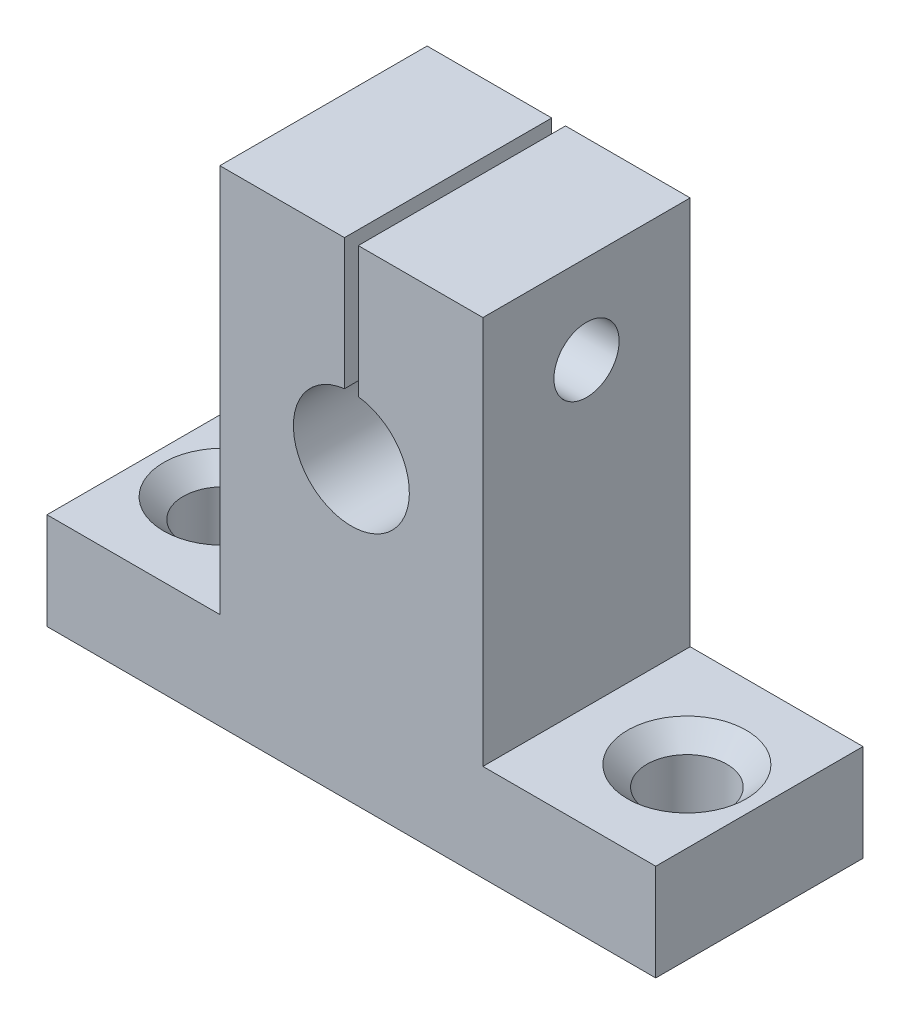
ISO-10303-21;
HEADER;
FILE_DESCRIPTION(('STEP AP214'),'2;1');
FILE_NAME('part.step','',(''),(''),'','','');
FILE_SCHEMA(('AUTOMOTIVE_DESIGN { 1 0 10303 214 1 1 1 1 }'));
ENDSEC;
DATA;
#1=APPLICATION_CONTEXT('core data for automotive mechanical design processes');
#2=APPLICATION_PROTOCOL_DEFINITION('international standard','automotive_design',2000,#1);
#3=PRODUCT_CONTEXT('',#1,'mechanical');
#4=PRODUCT('Part','Part','',(#3));
#5=PRODUCT_RELATED_PRODUCT_CATEGORY('part','',(#4));
#6=PRODUCT_DEFINITION_FORMATION('','',#4);
#7=PRODUCT_DEFINITION_CONTEXT('part definition',#1,'design');
#8=PRODUCT_DEFINITION('design','',#6,#7);
#9=PRODUCT_DEFINITION_SHAPE('','',#8);
#10=(LENGTH_UNIT() NAMED_UNIT(*) SI_UNIT(.MILLI.,.METRE.));
#11=(NAMED_UNIT(*) PLANE_ANGLE_UNIT() SI_UNIT($,.RADIAN.));
#12=(NAMED_UNIT(*) SI_UNIT($,.STERADIAN.) SOLID_ANGLE_UNIT());
#13=UNCERTAINTY_MEASURE_WITH_UNIT(LENGTH_MEASURE(1.E-05),#10,'distance_accuracy_value','');
#14=(GEOMETRIC_REPRESENTATION_CONTEXT(3) GLOBAL_UNCERTAINTY_ASSIGNED_CONTEXT((#13)) GLOBAL_UNIT_ASSIGNED_CONTEXT((#10,
#11,#12)) REPRESENTATION_CONTEXT('',''));
#15=CARTESIAN_POINT('',(0.,0.,0.));
#16=DIRECTION('',(0.,0.,1.));
#17=DIRECTION('',(1.,0.,0.));
#18=AXIS2_PLACEMENT_3D('',#15,#16,#17);
#19=CARTESIAN_POINT('',(11.925,33.5,7.15));
#20=DIRECTION('',(1.,0.,0.));
#21=DIRECTION('',(0.,0.,-1.));
#22=AXIS2_PLACEMENT_3D('',#19,#20,#21);
#23=PLANE('',#22);
#24=DIRECTION('',(0.,-1.,0.));
#25=VECTOR('',#24,1.);
#26=CARTESIAN_POINT('',(11.925,33.5,-7.15));
#27=LINE('',#26,#25);
#28=CARTESIAN_POINT('',(11.925,33.5,-7.15));
#29=VERTEX_POINT('',#28);
#30=CARTESIAN_POINT('',(11.925,6.68,-7.15));
#31=VERTEX_POINT('',#30);
#32=EDGE_CURVE('E166',#29,#31,#27,.T.);
#33=ORIENTED_EDGE('',*,*,#32,.T.);
#34=DIRECTION('',(0.,0.,-1.));
#35=VECTOR('',#34,1.);
#36=CARTESIAN_POINT('',(11.925,6.68,7.15));
#37=LINE('',#36,#35);
#38=CARTESIAN_POINT('',(11.925,6.68,7.15));
#39=VERTEX_POINT('',#38);
#40=EDGE_CURVE('E11',#39,#31,#37,.T.);
#41=ORIENTED_EDGE('',*,*,#40,.F.);
#42=DIRECTION('',(0.,-1.,0.));
#43=VECTOR('',#42,1.);
#44=CARTESIAN_POINT('',(11.925,33.5,7.15));
#45=LINE('',#44,#43);
#46=CARTESIAN_POINT('',(11.925,33.5,7.15));
#47=VERTEX_POINT('',#46);
#48=EDGE_CURVE('E189',#47,#39,#45,.T.);
#49=ORIENTED_EDGE('',*,*,#48,.F.);
#50=DIRECTION('',(0.,0.,-1.));
#51=VECTOR('',#50,1.);
#52=CARTESIAN_POINT('',(11.925,33.5,7.15));
#53=LINE('',#52,#51);
#54=EDGE_CURVE('E162',#47,#29,#53,.T.);
#55=ORIENTED_EDGE('',*,*,#54,.T.);
#56=EDGE_LOOP('',(#33,#41,#49,#55));
#57=FACE_BOUND('',#56,.T.);
#58=CARTESIAN_POINT('',(11.925,27.4,0.));
#59=DIRECTION('',(-1.,0.,0.));
#60=DIRECTION('',(0.,0.,1.));
#61=AXIS2_PLACEMENT_3D('',#58,#59,#60);
#62=CIRCLE('',#61,4.);
#63=CARTESIAN_POINT('',(11.925,27.4,4.));
#64=VERTEX_POINT('',#63);
#65=EDGE_CURVE('E475',#64,#64,#62,.T.);
#66=ORIENTED_EDGE('',*,*,#65,.F.);
#67=EDGE_LOOP('',(#66));
#68=FACE_BOUND('',#67,.T.);
#69=ADVANCED_FACE('F45',(#57,#68),#23,.F.);
#70=CARTESIAN_POINT('',(11.925,6.68,7.15));
#71=DIRECTION('',(0.,-1.,0.));
#72=DIRECTION('',(1.,0.,0.));
#73=AXIS2_PLACEMENT_3D('',#70,#71,#72);
#74=PLANE('',#73);
#75=CARTESIAN_POINT('',(5.,6.68,0.));
#76=DIRECTION('',(0.,1.,0.));
#77=DIRECTION('',(0.,0.,1.));
#78=AXIS2_PLACEMENT_3D('',#75,#76,#77);
#79=CIRCLE('',#78,4.1);
#80=CARTESIAN_POINT('',(5.,6.68,4.1));
#81=VERTEX_POINT('',#80);
#82=EDGE_CURVE('E505',#81,#81,#79,.T.);
#83=ORIENTED_EDGE('',*,*,#82,.F.);
#84=EDGE_LOOP('',(#83));
#85=FACE_BOUND('',#84,.T.);
#86=DIRECTION('',(-1.,0.,0.));
#87=VECTOR('',#86,1.);
#88=CARTESIAN_POINT('',(11.925,6.68,-7.15));
#89=LINE('',#88,#87);
#90=CARTESIAN_POINT('',(0.,6.68,-7.15));
#91=VERTEX_POINT('',#90);
#92=EDGE_CURVE('E169',#31,#91,#89,.T.);
#93=ORIENTED_EDGE('',*,*,#92,.T.);
#94=DIRECTION('',(0.,0.,-1.));
#95=VECTOR('',#94,1.);
#96=CARTESIAN_POINT('',(0.,6.68,7.15));
#97=LINE('',#96,#95);
#98=CARTESIAN_POINT('',(0.,6.68,7.15));
#99=VERTEX_POINT('',#98);
#100=EDGE_CURVE('E54',#99,#91,#97,.T.);
#101=ORIENTED_EDGE('',*,*,#100,.F.);
#102=DIRECTION('',(-1.,0.,0.));
#103=VECTOR('',#102,1.);
#104=CARTESIAN_POINT('',(11.925,6.68,7.15));
#105=LINE('',#104,#103);
#106=EDGE_CURVE('E117',#39,#99,#105,.T.);
#107=ORIENTED_EDGE('',*,*,#106,.F.);
#108=ORIENTED_EDGE('',*,*,#40,.T.);
#109=EDGE_LOOP('',(#93,#101,#107,#108));
#110=FACE_BOUND('',#109,.T.);
#111=ADVANCED_FACE('F271',(#85,#110),#74,.F.);
#112=CARTESIAN_POINT('',(0.,6.68,7.15));
#113=DIRECTION('',(1.,0.,0.));
#114=DIRECTION('',(0.,0.,-1.));
#115=AXIS2_PLACEMENT_3D('',#112,#113,#114);
#116=PLANE('',#115);
#117=DIRECTION('',(0.,-1.,0.));
#118=VECTOR('',#117,1.);
#119=CARTESIAN_POINT('',(0.,6.68,-7.15));
#120=LINE('',#119,#118);
#121=CARTESIAN_POINT('',(0.,0.,-7.15));
#122=VERTEX_POINT('',#121);
#123=EDGE_CURVE('E172',#91,#122,#120,.T.);
#124=ORIENTED_EDGE('',*,*,#123,.T.);
#125=DIRECTION('',(0.,0.,-1.));
#126=VECTOR('',#125,1.);
#127=CARTESIAN_POINT('',(0.,0.,7.15));
#128=LINE('',#127,#126);
#129=CARTESIAN_POINT('',(0.,0.,7.15));
#130=VERTEX_POINT('',#129);
#131=EDGE_CURVE('E208',#130,#122,#128,.T.);
#132=ORIENTED_EDGE('',*,*,#131,.F.);
#133=DIRECTION('',(0.,-1.,0.));
#134=VECTOR('',#133,1.);
#135=CARTESIAN_POINT('',(0.,6.68,7.15));
#136=LINE('',#135,#134);
#137=EDGE_CURVE('E217',#99,#130,#136,.T.);
#138=ORIENTED_EDGE('',*,*,#137,.F.);
#139=ORIENTED_EDGE('',*,*,#100,.T.);
#140=EDGE_LOOP('',(#124,#132,#138,#139));
#141=FACE_BOUND('',#140,.T.);
#142=ADVANCED_FACE('F215',(#141),#116,.F.);
#143=CARTESIAN_POINT('',(0.,0.,7.15));
#144=DIRECTION('',(0.,1.,0.));
#145=DIRECTION('',(0.,0.,1.));
#146=AXIS2_PLACEMENT_3D('',#143,#144,#145);
#147=PLANE('',#146);
#148=CARTESIAN_POINT('',(5.,0.,0.));
#149=DIRECTION('',(0.,1.,0.));
#150=DIRECTION('',(0.,0.,1.));
#151=AXIS2_PLACEMENT_3D('',#148,#149,#150);
#152=CIRCLE('',#151,2.75);
#153=CARTESIAN_POINT('',(5.,0.,2.75));
#154=VERTEX_POINT('',#153);
#155=EDGE_CURVE('E499',#154,#154,#152,.T.);
#156=ORIENTED_EDGE('',*,*,#155,.T.);
#157=EDGE_LOOP('',(#156));
#158=FACE_BOUND('',#157,.T.);
#159=CARTESIAN_POINT('',(37.,0.,0.));
#160=DIRECTION('',(0.,1.,0.));
#161=DIRECTION('',(0.,0.,1.));
#162=AXIS2_PLACEMENT_3D('',#159,#160,#161);
#163=CIRCLE('',#162,2.75);
#164=CARTESIAN_POINT('',(37.,0.,2.75));
#165=VERTEX_POINT('',#164);
#166=EDGE_CURVE('E490',#165,#165,#163,.T.);
#167=ORIENTED_EDGE('',*,*,#166,.T.);
#168=EDGE_LOOP('',(#167));
#169=FACE_BOUND('',#168,.T.);
#170=DIRECTION('',(1.,0.,0.));
#171=VECTOR('',#170,1.);
#172=CARTESIAN_POINT('',(0.,0.,-7.15));
#173=LINE('',#172,#171);
#174=CARTESIAN_POINT('',(42.,0.,-7.15));
#175=VERTEX_POINT('',#174);
#176=EDGE_CURVE('E174',#122,#175,#173,.T.);
#177=ORIENTED_EDGE('',*,*,#176,.T.);
#178=DIRECTION('',(0.,0.,-1.));
#179=VECTOR('',#178,1.);
#180=CARTESIAN_POINT('',(42.,0.,7.15));
#181=LINE('',#180,#179);
#182=CARTESIAN_POINT('',(42.,0.,7.15));
#183=VERTEX_POINT('',#182);
#184=EDGE_CURVE('E205',#183,#175,#181,.T.);
#185=ORIENTED_EDGE('',*,*,#184,.F.);
#186=DIRECTION('',(1.,0.,0.));
#187=VECTOR('',#186,1.);
#188=CARTESIAN_POINT('',(0.,0.,7.15));
#189=LINE('',#188,#187);
#190=EDGE_CURVE('E235',#130,#183,#189,.T.);
#191=ORIENTED_EDGE('',*,*,#190,.F.);
#192=ORIENTED_EDGE('',*,*,#131,.T.);
#193=EDGE_LOOP('',(#177,#185,#191,#192));
#194=FACE_BOUND('',#193,.T.);
#195=ADVANCED_FACE('F226',(#158,#169,#194),#147,.F.);
#196=CARTESIAN_POINT('',(42.,0.,7.15));
#197=DIRECTION('',(-1.,0.,0.));
#198=DIRECTION('',(0.,0.,1.));
#199=AXIS2_PLACEMENT_3D('',#196,#197,#198);
#200=PLANE('',#199);
#201=DIRECTION('',(0.,1.,0.));
#202=VECTOR('',#201,1.);
#203=CARTESIAN_POINT('',(42.,0.,-7.15));
#204=LINE('',#203,#202);
#205=CARTESIAN_POINT('',(42.,6.68,-7.15));
#206=VERTEX_POINT('',#205);
#207=EDGE_CURVE('E176',#175,#206,#204,.T.);
#208=ORIENTED_EDGE('',*,*,#207,.T.);
#209=DIRECTION('',(0.,0.,-1.));
#210=VECTOR('',#209,1.);
#211=CARTESIAN_POINT('',(42.,6.68,7.15));
#212=LINE('',#211,#210);
#213=CARTESIAN_POINT('',(42.,6.68,7.15));
#214=VERTEX_POINT('',#213);
#215=EDGE_CURVE('E202',#214,#206,#212,.T.);
#216=ORIENTED_EDGE('',*,*,#215,.F.);
#217=DIRECTION('',(0.,1.,0.));
#218=VECTOR('',#217,1.);
#219=CARTESIAN_POINT('',(42.,0.,7.15));
#220=LINE('',#219,#218);
#221=EDGE_CURVE('E232',#183,#214,#220,.T.);
#222=ORIENTED_EDGE('',*,*,#221,.F.);
#223=ORIENTED_EDGE('',*,*,#184,.T.);
#224=EDGE_LOOP('',(#208,#216,#222,#223));
#225=FACE_BOUND('',#224,.T.);
#226=ADVANCED_FACE('F230',(#225),#200,.F.);
#227=CARTESIAN_POINT('',(42.,6.68,7.15));
#228=DIRECTION('',(0.,-1.,0.));
#229=DIRECTION('',(0.,0.,-1.));
#230=AXIS2_PLACEMENT_3D('',#227,#228,#229);
#231=PLANE('',#230);
#232=CARTESIAN_POINT('',(37.,6.68,0.));
#233=DIRECTION('',(0.,1.,0.));
#234=DIRECTION('',(0.,0.,1.));
#235=AXIS2_PLACEMENT_3D('',#232,#233,#234);
#236=CIRCLE('',#235,4.1);
#237=CARTESIAN_POINT('',(37.,6.68,4.1));
#238=VERTEX_POINT('',#237);
#239=EDGE_CURVE('E496',#238,#238,#236,.T.);
#240=ORIENTED_EDGE('',*,*,#239,.F.);
#241=EDGE_LOOP('',(#240));
#242=FACE_BOUND('',#241,.T.);
#243=DIRECTION('',(-1.,0.,0.));
#244=VECTOR('',#243,1.);
#245=CARTESIAN_POINT('',(42.,6.68,-7.15));
#246=LINE('',#245,#244);
#247=CARTESIAN_POINT('',(30.075,6.68,-7.15));
#248=VERTEX_POINT('',#247);
#249=EDGE_CURVE('E178',#206,#248,#246,.T.);
#250=ORIENTED_EDGE('',*,*,#249,.T.);
#251=DIRECTION('',(0.,0.,-1.));
#252=VECTOR('',#251,1.);
#253=CARTESIAN_POINT('',(30.075,6.68,7.15));
#254=LINE('',#253,#252);
#255=CARTESIAN_POINT('',(30.075,6.68,7.15));
#256=VERTEX_POINT('',#255);
#257=EDGE_CURVE('E199',#256,#248,#254,.T.);
#258=ORIENTED_EDGE('',*,*,#257,.F.);
#259=DIRECTION('',(-1.,0.,0.));
#260=VECTOR('',#259,1.);
#261=CARTESIAN_POINT('',(42.,6.68,7.15));
#262=LINE('',#261,#260);
#263=EDGE_CURVE('E234',#214,#256,#262,.T.);
#264=ORIENTED_EDGE('',*,*,#263,.F.);
#265=ORIENTED_EDGE('',*,*,#215,.T.);
#266=EDGE_LOOP('',(#250,#258,#264,#265));
#267=FACE_BOUND('',#266,.T.);
#268=ADVANCED_FACE('F290',(#242,#267),#231,.F.);
#269=CARTESIAN_POINT('',(30.075,6.68,7.15));
#270=DIRECTION('',(-1.,0.,0.));
#271=DIRECTION('',(0.,0.,1.));
#272=AXIS2_PLACEMENT_3D('',#269,#270,#271);
#273=PLANE('',#272);
#274=CARTESIAN_POINT('',(30.075,27.4,0.));
#275=DIRECTION('',(-1.,0.,0.));
#276=DIRECTION('',(0.,0.,1.));
#277=AXIS2_PLACEMENT_3D('',#274,#275,#276);
#278=CIRCLE('',#277,2.25);
#279=CARTESIAN_POINT('',(30.075,27.4,2.25));
#280=VERTEX_POINT('',#279);
#281=EDGE_CURVE('E170',#280,#280,#278,.T.);
#282=ORIENTED_EDGE('',*,*,#281,.T.);
#283=EDGE_LOOP('',(#282));
#284=FACE_BOUND('',#283,.T.);
#285=DIRECTION('',(0.,1.,0.));
#286=VECTOR('',#285,1.);
#287=CARTESIAN_POINT('',(30.075,6.68,-7.15));
#288=LINE('',#287,#286);
#289=CARTESIAN_POINT('',(30.075,33.5,-7.15));
#290=VERTEX_POINT('',#289);
#291=EDGE_CURVE('E180',#248,#290,#288,.T.);
#292=ORIENTED_EDGE('',*,*,#291,.T.);
#293=DIRECTION('',(0.,0.,-1.));
#294=VECTOR('',#293,1.);
#295=CARTESIAN_POINT('',(30.075,33.5,7.15));
#296=LINE('',#295,#294);
#297=CARTESIAN_POINT('',(30.075,33.5,7.15));
#298=VERTEX_POINT('',#297);
#299=EDGE_CURVE('E196',#298,#290,#296,.T.);
#300=ORIENTED_EDGE('',*,*,#299,.F.);
#301=DIRECTION('',(0.,1.,0.));
#302=VECTOR('',#301,1.);
#303=CARTESIAN_POINT('',(30.075,6.68,7.15));
#304=LINE('',#303,#302);
#305=EDGE_CURVE('E237',#256,#298,#304,.T.);
#306=ORIENTED_EDGE('',*,*,#305,.F.);
#307=ORIENTED_EDGE('',*,*,#257,.T.);
#308=EDGE_LOOP('',(#292,#300,#306,#307));
#309=FACE_BOUND('',#308,.T.);
#310=ADVANCED_FACE('F293',(#284,#309),#273,.F.);
#311=CARTESIAN_POINT('',(30.075,33.5,7.15));
#312=DIRECTION('',(0.,-1.,0.));
#313=DIRECTION('',(1.,0.,0.));
#314=AXIS2_PLACEMENT_3D('',#311,#312,#313);
#315=PLANE('',#314);
#316=DIRECTION('',(-1.,0.,0.));
#317=VECTOR('',#316,1.);
#318=CARTESIAN_POINT('',(30.075,33.5,-7.15));
#319=LINE('',#318,#317);
#320=CARTESIAN_POINT('',(21.475,33.5,-7.15));
#321=VERTEX_POINT('',#320);
#322=EDGE_CURVE('E182',#290,#321,#319,.T.);
#323=ORIENTED_EDGE('',*,*,#322,.T.);
#324=DIRECTION('',(0.,0.,-1.));
#325=VECTOR('',#324,1.);
#326=CARTESIAN_POINT('',(21.475,33.5,7.15));
#327=LINE('',#326,#325);
#328=CARTESIAN_POINT('',(21.475,33.5,7.15));
#329=VERTEX_POINT('',#328);
#330=EDGE_CURVE('E193',#329,#321,#327,.T.);
#331=ORIENTED_EDGE('',*,*,#330,.F.);
#332=DIRECTION('',(-1.,0.,0.));
#333=VECTOR('',#332,1.);
#334=CARTESIAN_POINT('',(30.075,33.5,7.15));
#335=LINE('',#334,#333);
#336=EDGE_CURVE('E243',#298,#329,#335,.T.);
#337=ORIENTED_EDGE('',*,*,#336,.F.);
#338=ORIENTED_EDGE('',*,*,#299,.T.);
#339=EDGE_LOOP('',(#323,#331,#337,#338));
#340=FACE_BOUND('',#339,.T.);
#341=ADVANCED_FACE('F249',(#340),#315,.F.);
#342=CARTESIAN_POINT('',(21.475,24.471696740689,7.15));
#343=DIRECTION('',(1.,0.,0.));
#344=DIRECTION('',(0.,1.,0.));
#345=AXIS2_PLACEMENT_3D('',#342,#343,#344);
#346=PLANE('',#345);
#347=CARTESIAN_POINT('',(21.475,27.4,0.));
#348=DIRECTION('',(1.,0.,0.));
#349=DIRECTION('',(0.,1.,0.));
#350=AXIS2_PLACEMENT_3D('',#347,#348,#349);
#351=CIRCLE('',#350,2.25);
#352=CARTESIAN_POINT('',(21.475,29.65,0.));
#353=VERTEX_POINT('',#352);
#354=EDGE_CURVE('E469',#353,#353,#351,.T.);
#355=ORIENTED_EDGE('',*,*,#354,.T.);
#356=EDGE_LOOP('',(#355));
#357=FACE_BOUND('',#356,.T.);
#358=DIRECTION('',(0.,-1.,0.));
#359=VECTOR('',#358,1.);
#360=CARTESIAN_POINT('',(21.475,24.471696740689,-7.15));
#361=LINE('',#360,#359);
#362=CARTESIAN_POINT('',(21.475,24.471696740689,-7.15));
#363=VERTEX_POINT('',#362);
#364=EDGE_CURVE('E184',#321,#363,#361,.T.);
#365=ORIENTED_EDGE('',*,*,#364,.T.);
#366=DIRECTION('',(0.,0.,-1.));
#367=VECTOR('',#366,1.);
#368=CARTESIAN_POINT('',(21.475,24.471696740689,7.15));
#369=LINE('',#368,#367);
#370=CARTESIAN_POINT('',(21.475,24.471696740689,7.15));
#371=VERTEX_POINT('',#370);
#372=EDGE_CURVE('E157',#371,#363,#369,.T.);
#373=ORIENTED_EDGE('',*,*,#372,.F.);
#374=DIRECTION('',(0.,-1.,0.));
#375=VECTOR('',#374,1.);
#376=CARTESIAN_POINT('',(21.475,24.471696740689,7.15));
#377=LINE('',#376,#375);
#378=EDGE_CURVE('E148',#329,#371,#377,.T.);
#379=ORIENTED_EDGE('',*,*,#378,.F.);
#380=ORIENTED_EDGE('',*,*,#330,.T.);
#381=EDGE_LOOP('',(#365,#373,#379,#380));
#382=FACE_BOUND('',#381,.T.);
#383=ADVANCED_FACE('F253',(#357,#382),#346,.F.);
#384=CARTESIAN_POINT('',(21.,20.5,7.15));
#385=DIRECTION('',(0.,0.,-1.));
#386=DIRECTION('',(-1.,0.,0.));
#387=AXIS2_PLACEMENT_3D('',#384,#385,#386);
#388=CYLINDRICAL_SURFACE('',#387,4.);
#389=CARTESIAN_POINT('',(21.,20.5,-7.15));
#390=DIRECTION('',(0.,0.,-1.));
#391=DIRECTION('',(1.,0.,0.));
#392=AXIS2_PLACEMENT_3D('',#389,#390,#391);
#393=CIRCLE('',#392,4.);
#394=CARTESIAN_POINT('',(20.525,24.471696740689,-7.15));
#395=VERTEX_POINT('',#394);
#396=EDGE_CURVE('E156',#363,#395,#393,.T.);
#397=ORIENTED_EDGE('',*,*,#396,.T.);
#398=DIRECTION('',(0.,0.,-1.));
#399=VECTOR('',#398,1.);
#400=CARTESIAN_POINT('',(20.525,24.471696740689,7.15));
#401=LINE('',#400,#399);
#402=CARTESIAN_POINT('',(20.525,24.471696740689,7.15));
#403=VERTEX_POINT('',#402);
#404=EDGE_CURVE('E153',#403,#395,#401,.T.);
#405=ORIENTED_EDGE('',*,*,#404,.F.);
#406=CARTESIAN_POINT('',(21.,20.5,7.15));
#407=DIRECTION('',(0.,0.,-1.));
#408=DIRECTION('',(1.,0.,0.));
#409=AXIS2_PLACEMENT_3D('',#406,#407,#408);
#410=CIRCLE('',#409,4.);
#411=EDGE_CURVE('E142',#371,#403,#410,.T.);
#412=ORIENTED_EDGE('',*,*,#411,.F.);
#413=ORIENTED_EDGE('',*,*,#372,.T.);
#414=EDGE_LOOP('',(#397,#405,#412,#413));
#415=FACE_BOUND('',#414,.T.);
#416=ADVANCED_FACE('F154',(#415),#388,.F.);
#417=CARTESIAN_POINT('',(20.525,33.5,7.15));
#418=DIRECTION('',(-1.,0.,0.));
#419=DIRECTION('',(0.,0.,1.));
#420=AXIS2_PLACEMENT_3D('',#417,#418,#419);
#421=PLANE('',#420);
#422=CARTESIAN_POINT('',(20.525,27.4,0.));
#423=DIRECTION('',(-1.,0.,0.));
#424=DIRECTION('',(0.,0.,1.));
#425=AXIS2_PLACEMENT_3D('',#422,#423,#424);
#426=CIRCLE('',#425,2.25);
#427=CARTESIAN_POINT('',(20.525,27.4,2.25));
#428=VERTEX_POINT('',#427);
#429=EDGE_CURVE('E48',#428,#428,#426,.T.);
#430=ORIENTED_EDGE('',*,*,#429,.T.);
#431=EDGE_LOOP('',(#430));
#432=FACE_BOUND('',#431,.T.);
#433=DIRECTION('',(0.,1.,0.));
#434=VECTOR('',#433,1.);
#435=CARTESIAN_POINT('',(20.525,33.5,-7.15));
#436=LINE('',#435,#434);
#437=CARTESIAN_POINT('',(20.525,33.5,-7.15));
#438=VERTEX_POINT('',#437);
#439=EDGE_CURVE('E103',#395,#438,#436,.T.);
#440=ORIENTED_EDGE('',*,*,#439,.T.);
#441=DIRECTION('',(0.,0.,-1.));
#442=VECTOR('',#441,1.);
#443=CARTESIAN_POINT('',(20.525,33.5,7.15));
#444=LINE('',#443,#442);
#445=CARTESIAN_POINT('',(20.525,33.5,7.15));
#446=VERTEX_POINT('',#445);
#447=EDGE_CURVE('E158',#446,#438,#444,.T.);
#448=ORIENTED_EDGE('',*,*,#447,.F.);
#449=DIRECTION('',(0.,1.,0.));
#450=VECTOR('',#449,1.);
#451=CARTESIAN_POINT('',(20.525,33.5,7.15));
#452=LINE('',#451,#450);
#453=EDGE_CURVE('E146',#403,#446,#452,.T.);
#454=ORIENTED_EDGE('',*,*,#453,.F.);
#455=ORIENTED_EDGE('',*,*,#404,.T.);
#456=EDGE_LOOP('',(#440,#448,#454,#455));
#457=FACE_BOUND('',#456,.T.);
#458=ADVANCED_FACE('F160',(#432,#457),#421,.F.);
#459=CARTESIAN_POINT('',(20.525,33.5,7.15));
#460=DIRECTION('',(0.,-1.,0.));
#461=DIRECTION('',(1.,0.,0.));
#462=AXIS2_PLACEMENT_3D('',#459,#460,#461);
#463=PLANE('',#462);
#464=DIRECTION('',(-1.,0.,0.));
#465=VECTOR('',#464,1.);
#466=CARTESIAN_POINT('',(20.525,33.5,-7.15));
#467=LINE('',#466,#465);
#468=EDGE_CURVE('E109',#438,#29,#467,.T.);
#469=ORIENTED_EDGE('',*,*,#468,.T.);
#470=ORIENTED_EDGE('',*,*,#54,.F.);
#471=DIRECTION('',(-1.,0.,0.));
#472=VECTOR('',#471,1.);
#473=CARTESIAN_POINT('',(20.525,33.5,7.15));
#474=LINE('',#473,#472);
#475=EDGE_CURVE('E62',#446,#47,#474,.T.);
#476=ORIENTED_EDGE('',*,*,#475,.F.);
#477=ORIENTED_EDGE('',*,*,#447,.T.);
#478=EDGE_LOOP('',(#469,#470,#476,#477));
#479=FACE_BOUND('',#478,.T.);
#480=ADVANCED_FACE('F258',(#479),#463,.F.);
#481=CARTESIAN_POINT('',(21.,20.5,7.15));
#482=DIRECTION('',(0.,0.,1.));
#483=DIRECTION('',(1.,0.,0.));
#484=AXIS2_PLACEMENT_3D('',#481,#482,#483);
#485=PLANE('',#484);
#486=ORIENTED_EDGE('',*,*,#48,.T.);
#487=ORIENTED_EDGE('',*,*,#106,.T.);
#488=ORIENTED_EDGE('',*,*,#137,.T.);
#489=ORIENTED_EDGE('',*,*,#190,.T.);
#490=ORIENTED_EDGE('',*,*,#221,.T.);
#491=ORIENTED_EDGE('',*,*,#263,.T.);
#492=ORIENTED_EDGE('',*,*,#305,.T.);
#493=ORIENTED_EDGE('',*,*,#336,.T.);
#494=ORIENTED_EDGE('',*,*,#378,.T.);
#495=ORIENTED_EDGE('',*,*,#411,.T.);
#496=ORIENTED_EDGE('',*,*,#453,.T.);
#497=ORIENTED_EDGE('',*,*,#475,.T.);
#498=EDGE_LOOP('',(#486,#487,#488,#489,#490,#491,#492,#493,#494,#495,#496,#497));
#499=FACE_BOUND('',#498,.T.);
#500=ADVANCED_FACE('F144',(#499),#485,.T.);
#501=CARTESIAN_POINT('',(21.,20.5,-7.15));
#502=DIRECTION('',(0.,0.,1.));
#503=DIRECTION('',(1.,0.,0.));
#504=AXIS2_PLACEMENT_3D('',#501,#502,#503);
#505=PLANE('',#504);
#506=ORIENTED_EDGE('',*,*,#32,.F.);
#507=ORIENTED_EDGE('',*,*,#468,.F.);
#508=ORIENTED_EDGE('',*,*,#439,.F.);
#509=ORIENTED_EDGE('',*,*,#396,.F.);
#510=ORIENTED_EDGE('',*,*,#364,.F.);
#511=ORIENTED_EDGE('',*,*,#322,.F.);
#512=ORIENTED_EDGE('',*,*,#291,.F.);
#513=ORIENTED_EDGE('',*,*,#249,.F.);
#514=ORIENTED_EDGE('',*,*,#207,.F.);
#515=ORIENTED_EDGE('',*,*,#176,.F.);
#516=ORIENTED_EDGE('',*,*,#123,.F.);
#517=ORIENTED_EDGE('',*,*,#92,.F.);
#518=EDGE_LOOP('',(#506,#507,#508,#509,#510,#511,#512,#513,#514,#515,#516,#517));
#519=FACE_BOUND('',#518,.T.);
#520=ADVANCED_FACE('F221',(#519),#505,.F.);
#521=CARTESIAN_POINT('',(11.925,27.4,0.));
#522=DIRECTION('',(-1.,0.,0.));
#523=DIRECTION('',(0.,0.,1.));
#524=AXIS2_PLACEMENT_3D('',#521,#522,#523);
#525=CYLINDRICAL_SURFACE('',#524,2.25);
#526=CARTESIAN_POINT('',(16.325,27.4,0.));
#527=DIRECTION('',(-1.,0.,0.));
#528=DIRECTION('',(0.,0.,1.));
#529=AXIS2_PLACEMENT_3D('',#526,#527,#528);
#530=CIRCLE('',#529,2.25);
#531=CARTESIAN_POINT('',(16.325,27.4,2.25));
#532=VERTEX_POINT('',#531);
#533=EDGE_CURVE('E466',#532,#532,#530,.T.);
#534=ORIENTED_EDGE('',*,*,#533,.T.);
#535=EDGE_LOOP('',(#534));
#536=FACE_BOUND('',#535,.T.);
#537=ORIENTED_EDGE('',*,*,#429,.F.);
#538=EDGE_LOOP('',(#537));
#539=FACE_BOUND('',#538,.T.);
#540=ADVANCED_FACE('F388',(#536,#539),#525,.F.);
#541=CARTESIAN_POINT('',(16.325,29.65,0.));
#542=DIRECTION('',(1.,0.,0.));
#543=DIRECTION('',(0.,0.,-1.));
#544=AXIS2_PLACEMENT_3D('',#541,#542,#543);
#545=PLANE('',#544);
#546=ORIENTED_EDGE('',*,*,#533,.F.);
#547=EDGE_LOOP('',(#546));
#548=FACE_BOUND('',#547,.T.);
#549=CARTESIAN_POINT('',(16.325,27.4,0.));
#550=DIRECTION('',(-1.,0.,0.));
#551=DIRECTION('',(0.,0.,1.));
#552=AXIS2_PLACEMENT_3D('',#549,#550,#551);
#553=CIRCLE('',#552,4.);
#554=CARTESIAN_POINT('',(16.325,27.4,4.));
#555=VERTEX_POINT('',#554);
#556=EDGE_CURVE('E472',#555,#555,#553,.T.);
#557=ORIENTED_EDGE('',*,*,#556,.T.);
#558=EDGE_LOOP('',(#557));
#559=FACE_BOUND('',#558,.T.);
#560=ADVANCED_FACE('F395',(#548,#559),#545,.F.);
#561=CARTESIAN_POINT('',(11.925,27.4,0.));
#562=DIRECTION('',(-1.,0.,0.));
#563=DIRECTION('',(0.,0.,1.));
#564=AXIS2_PLACEMENT_3D('',#561,#562,#563);
#565=CYLINDRICAL_SURFACE('',#564,4.);
#566=ORIENTED_EDGE('',*,*,#556,.F.);
#567=EDGE_LOOP('',(#566));
#568=FACE_BOUND('',#567,.T.);
#569=ORIENTED_EDGE('',*,*,#65,.T.);
#570=EDGE_LOOP('',(#569));
#571=FACE_BOUND('',#570,.T.);
#572=ADVANCED_FACE('F385',(#568,#571),#565,.F.);
#573=ORIENTED_EDGE('',*,*,#354,.F.);
#574=EDGE_LOOP('',(#573));
#575=FACE_BOUND('',#574,.T.);
#576=ORIENTED_EDGE('',*,*,#281,.F.);
#577=EDGE_LOOP('',(#576));
#578=FACE_BOUND('',#577,.T.);
#579=ADVANCED_FACE('F346',(#575,#578),#525,.F.);
#580=CARTESIAN_POINT('',(37.,6.68,0.));
#581=DIRECTION('',(0.,1.,0.));
#582=DIRECTION('',(0.,0.,1.));
#583=AXIS2_PLACEMENT_3D('',#580,#581,#582);
#584=CYLINDRICAL_SURFACE('',#583,2.75);
#585=ORIENTED_EDGE('',*,*,#166,.F.);
#586=EDGE_LOOP('',(#585));
#587=FACE_BOUND('',#586,.T.);
#588=CARTESIAN_POINT('',(37.,5.33,0.));
#589=DIRECTION('',(0.,1.,0.));
#590=DIRECTION('',(0.,0.,1.));
#591=AXIS2_PLACEMENT_3D('',#588,#589,#590);
#592=CIRCLE('',#591,2.75);
#593=CARTESIAN_POINT('',(37.,5.33,2.75));
#594=VERTEX_POINT('',#593);
#595=EDGE_CURVE('E493',#594,#594,#592,.T.);
#596=ORIENTED_EDGE('',*,*,#595,.T.);
#597=EDGE_LOOP('',(#596));
#598=FACE_BOUND('',#597,.T.);
#599=ADVANCED_FACE('F341',(#587,#598),#584,.F.);
#600=CARTESIAN_POINT('',(37.,6.68,0.));
#601=DIRECTION('',(0.,1.,0.));
#602=DIRECTION('',(0.,0.,1.));
#603=AXIS2_PLACEMENT_3D('',#600,#601,#602);
#604=CONICAL_SURFACE('',#603,4.1,0.785398163397448);
#605=ORIENTED_EDGE('',*,*,#595,.F.);
#606=EDGE_LOOP('',(#605));
#607=FACE_BOUND('',#606,.T.);
#608=ORIENTED_EDGE('',*,*,#239,.T.);
#609=EDGE_LOOP('',(#608));
#610=FACE_BOUND('',#609,.T.);
#611=ADVANCED_FACE('F345',(#607,#610),#604,.F.);
#612=CARTESIAN_POINT('',(5.,6.68,0.));
#613=DIRECTION('',(0.,1.,0.));
#614=DIRECTION('',(0.,0.,1.));
#615=AXIS2_PLACEMENT_3D('',#612,#613,#614);
#616=CYLINDRICAL_SURFACE('',#615,2.75);
#617=ORIENTED_EDGE('',*,*,#155,.F.);
#618=EDGE_LOOP('',(#617));
#619=FACE_BOUND('',#618,.T.);
#620=CARTESIAN_POINT('',(5.,5.33,0.));
#621=DIRECTION('',(0.,1.,0.));
#622=DIRECTION('',(0.,0.,1.));
#623=AXIS2_PLACEMENT_3D('',#620,#621,#622);
#624=CIRCLE('',#623,2.75);
#625=CARTESIAN_POINT('',(5.,5.33,2.75));
#626=VERTEX_POINT('',#625);
#627=EDGE_CURVE('E502',#626,#626,#624,.T.);
#628=ORIENTED_EDGE('',*,*,#627,.T.);
#629=EDGE_LOOP('',(#628));
#630=FACE_BOUND('',#629,.T.);
#631=ADVANCED_FACE('F356',(#619,#630),#616,.F.);
#632=CARTESIAN_POINT('',(5.,6.68,0.));
#633=DIRECTION('',(0.,1.,0.));
#634=DIRECTION('',(0.,0.,1.));
#635=AXIS2_PLACEMENT_3D('',#632,#633,#634);
#636=CONICAL_SURFACE('',#635,4.1,0.785398163397449);
#637=ORIENTED_EDGE('',*,*,#627,.F.);
#638=EDGE_LOOP('',(#637));
#639=FACE_BOUND('',#638,.T.);
#640=ORIENTED_EDGE('',*,*,#82,.T.);
#641=EDGE_LOOP('',(#640));
#642=FACE_BOUND('',#641,.T.);
#643=ADVANCED_FACE('F365',(#639,#642),#636,.F.);
#644=CLOSED_SHELL('',(#69,#111,#142,#195,#226,#268,#310,#341,#383,#416,#458,#480,#500,#520,#540,
#560,#572,#579,#599,#611,#631,#643));
#645=MANIFOLD_SOLID_BREP('B2',#644);
#646=ADVANCED_BREP_SHAPE_REPRESENTATION('',(#18,#645),#14);
#647=SHAPE_DEFINITION_REPRESENTATION(#9,#646);
ENDSEC;
END-ISO-10303-21;
